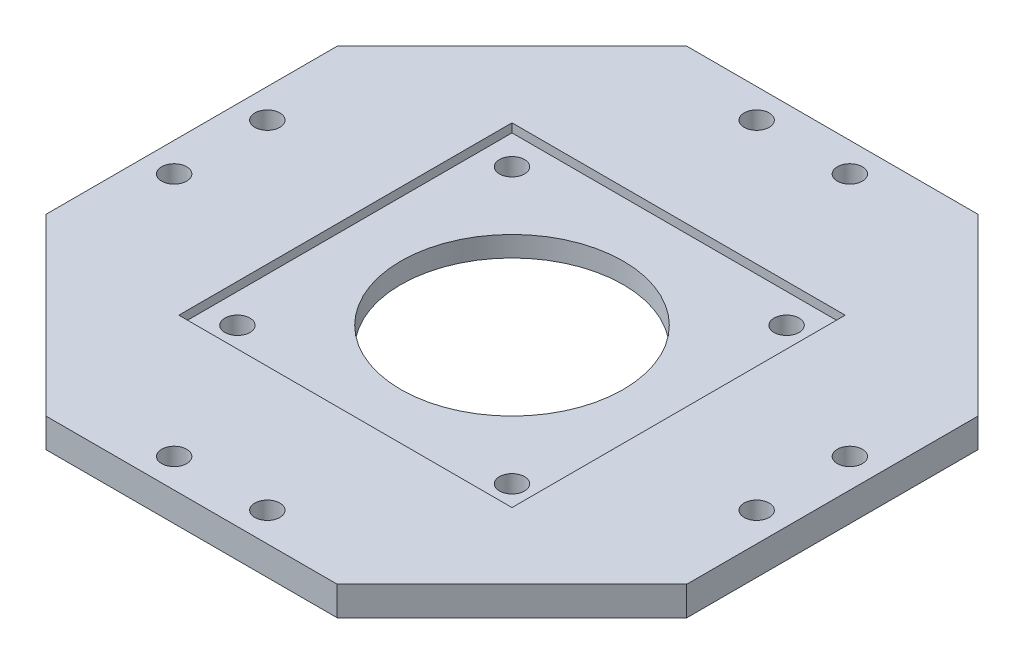
ISO-10303-21;
HEADER;
FILE_DESCRIPTION(('STEP AP214'),'2;1');
FILE_NAME('part.step','',(''),(''),'','','');
FILE_SCHEMA(('AUTOMOTIVE_DESIGN { 1 0 10303 214 1 1 1 1 }'));
ENDSEC;
DATA;
#1=APPLICATION_CONTEXT('core data for automotive mechanical design processes');
#2=APPLICATION_PROTOCOL_DEFINITION('international standard','automotive_design',2000,#1);
#3=PRODUCT_CONTEXT('',#1,'mechanical');
#4=PRODUCT('Part','Part','',(#3));
#5=PRODUCT_RELATED_PRODUCT_CATEGORY('part','',(#4));
#6=PRODUCT_DEFINITION_FORMATION('','',#4);
#7=PRODUCT_DEFINITION_CONTEXT('part definition',#1,'design');
#8=PRODUCT_DEFINITION('design','',#6,#7);
#9=PRODUCT_DEFINITION_SHAPE('','',#8);
#10=(LENGTH_UNIT() NAMED_UNIT(*) SI_UNIT(.MILLI.,.METRE.));
#11=(NAMED_UNIT(*) PLANE_ANGLE_UNIT() SI_UNIT($,.RADIAN.));
#12=(NAMED_UNIT(*) SI_UNIT($,.STERADIAN.) SOLID_ANGLE_UNIT());
#13=UNCERTAINTY_MEASURE_WITH_UNIT(LENGTH_MEASURE(1.E-05),#10,'distance_accuracy_value','');
#14=(GEOMETRIC_REPRESENTATION_CONTEXT(3) GLOBAL_UNCERTAINTY_ASSIGNED_CONTEXT((#13)) GLOBAL_UNIT_ASSIGNED_CONTEXT((#10,
#11,#12)) REPRESENTATION_CONTEXT('',''));
#15=CARTESIAN_POINT('',(0.,0.,0.));
#16=DIRECTION('',(0.,0.,1.));
#17=DIRECTION('',(1.,0.,0.));
#18=AXIS2_PLACEMENT_3D('',#15,#16,#17);
#19=CARTESIAN_POINT('',(0.,5.,0.));
#20=DIRECTION('',(0.,-1.,0.));
#21=DIRECTION('',(0.,0.,-1.));
#22=AXIS2_PLACEMENT_3D('',#19,#20,#21);
#23=PLANE('',#22);
#24=DIRECTION('',(-1.,0.,0.));
#25=VECTOR('',#24,1.);
#26=CARTESIAN_POINT('',(-28.6,5.,-28.6));
#27=LINE('',#26,#25);
#28=CARTESIAN_POINT('',(28.6,5.,-28.6));
#29=VERTEX_POINT('',#28);
#30=CARTESIAN_POINT('',(-28.6,5.,-28.6));
#31=VERTEX_POINT('',#30);
#32=EDGE_CURVE('E347',#29,#31,#27,.T.);
#33=ORIENTED_EDGE('',*,*,#32,.F.);
#34=DIRECTION('',(0.,0.,-1.));
#35=VECTOR('',#34,1.);
#36=CARTESIAN_POINT('',(28.6,5.,28.6));
#37=LINE('',#36,#35);
#38=CARTESIAN_POINT('',(28.6,5.,28.6));
#39=VERTEX_POINT('',#38);
#40=EDGE_CURVE('E56',#39,#29,#37,.T.);
#41=ORIENTED_EDGE('',*,*,#40,.F.);
#42=DIRECTION('',(1.,0.,0.));
#43=VECTOR('',#42,1.);
#44=CARTESIAN_POINT('',(-28.6,5.,28.6));
#45=LINE('',#44,#43);
#46=CARTESIAN_POINT('',(-28.6,5.,28.6));
#47=VERTEX_POINT('',#46);
#48=EDGE_CURVE('E338',#47,#39,#45,.T.);
#49=ORIENTED_EDGE('',*,*,#48,.F.);
#50=DIRECTION('',(0.,0.,1.));
#51=VECTOR('',#50,1.);
#52=CARTESIAN_POINT('',(-28.6,5.,28.6));
#53=LINE('',#52,#51);
#54=EDGE_CURVE('E343',#31,#47,#53,.T.);
#55=ORIENTED_EDGE('',*,*,#54,.F.);
#56=EDGE_LOOP('',(#33,#41,#49,#55));
#57=FACE_BOUND('',#56,.T.);
#58=DIRECTION('',(-0.707106781186547,0.,0.707106781186547));
#59=VECTOR('',#58,1.);
#60=CARTESIAN_POINT('',(-54.9999999999998,5.,-24.9999999999998));
#61=LINE('',#60,#59);
#62=CARTESIAN_POINT('',(-24.9999999999998,5.,-54.9999999999998));
#63=VERTEX_POINT('',#62);
#64=CARTESIAN_POINT('',(-54.9999999999998,5.,-24.9999999999998));
#65=VERTEX_POINT('',#64);
#66=EDGE_CURVE('E178',#63,#65,#61,.T.);
#67=ORIENTED_EDGE('',*,*,#66,.T.);
#68=DIRECTION('',(0.,0.,1.));
#69=VECTOR('',#68,1.);
#70=CARTESIAN_POINT('',(-54.9999999999998,5.,25.));
#71=LINE('',#70,#69);
#72=CARTESIAN_POINT('',(-54.9999999999998,5.,25.));
#73=VERTEX_POINT('',#72);
#74=EDGE_CURVE('E106',#65,#73,#71,.T.);
#75=ORIENTED_EDGE('',*,*,#74,.T.);
#76=DIRECTION('',(0.707106781186547,0.,0.707106781186548));
#77=VECTOR('',#76,1.);
#78=CARTESIAN_POINT('',(-24.9999999999998,5.,55.));
#79=LINE('',#78,#77);
#80=CARTESIAN_POINT('',(-24.9999999999998,5.,55.));
#81=VERTEX_POINT('',#80);
#82=EDGE_CURVE('E200',#73,#81,#79,.T.);
#83=ORIENTED_EDGE('',*,*,#82,.T.);
#84=DIRECTION('',(1.,0.,0.));
#85=VECTOR('',#84,1.);
#86=CARTESIAN_POINT('',(-24.9999999999998,5.,55.));
#87=LINE('',#86,#85);
#88=CARTESIAN_POINT('',(24.9999999999999,5.,55.));
#89=VERTEX_POINT('',#88);
#90=EDGE_CURVE('E214',#81,#89,#87,.T.);
#91=ORIENTED_EDGE('',*,*,#90,.T.);
#92=DIRECTION('',(0.707106781186547,0.,-0.707106781186547));
#93=VECTOR('',#92,1.);
#94=CARTESIAN_POINT('',(24.9999999999999,5.,55.));
#95=LINE('',#94,#93);
#96=CARTESIAN_POINT('',(54.9999999999999,5.,25.));
#97=VERTEX_POINT('',#96);
#98=EDGE_CURVE('E129',#89,#97,#95,.T.);
#99=ORIENTED_EDGE('',*,*,#98,.T.);
#100=DIRECTION('',(0.,0.,-1.));
#101=VECTOR('',#100,1.);
#102=CARTESIAN_POINT('',(54.9999999999999,5.,25.));
#103=LINE('',#102,#101);
#104=CARTESIAN_POINT('',(54.9999999999999,5.,-24.9999999999998));
#105=VERTEX_POINT('',#104);
#106=EDGE_CURVE('E122',#97,#105,#103,.T.);
#107=ORIENTED_EDGE('',*,*,#106,.T.);
#108=DIRECTION('',(-0.707106781186547,0.,-0.707106781186547));
#109=VECTOR('',#108,1.);
#110=CARTESIAN_POINT('',(24.9999999999999,5.,-54.9999999999998));
#111=LINE('',#110,#109);
#112=CARTESIAN_POINT('',(24.9999999999999,5.,-54.9999999999998));
#113=VERTEX_POINT('',#112);
#114=EDGE_CURVE('E126',#105,#113,#111,.T.);
#115=ORIENTED_EDGE('',*,*,#114,.T.);
#116=DIRECTION('',(-1.,0.,0.));
#117=VECTOR('',#116,1.);
#118=CARTESIAN_POINT('',(-24.9999999999998,5.,-54.9999999999998));
#119=LINE('',#118,#117);
#120=EDGE_CURVE('E65',#113,#63,#119,.T.);
#121=ORIENTED_EDGE('',*,*,#120,.T.);
#122=EDGE_LOOP('',(#67,#75,#83,#91,#99,#107,#115,#121));
#123=FACE_BOUND('',#122,.T.);
#124=CARTESIAN_POINT('',(-8.00000000000001,5.,-50.));
#125=DIRECTION('',(0.,1.,0.));
#126=DIRECTION('',(0.,0.,1.));
#127=AXIS2_PLACEMENT_3D('',#124,#125,#126);
#128=CIRCLE('',#127,2.15000000000002);
#129=CARTESIAN_POINT('',(-8.00000000000001,5.,-47.8499999999999));
#130=VERTEX_POINT('',#129);
#131=EDGE_CURVE('E243',#130,#130,#128,.T.);
#132=ORIENTED_EDGE('',*,*,#131,.F.);
#133=EDGE_LOOP('',(#132));
#134=FACE_BOUND('',#133,.T.);
#135=CARTESIAN_POINT('',(8.00000000000017,5.,-50.));
#136=DIRECTION('',(0.,1.,0.));
#137=DIRECTION('',(0.,0.,-1.));
#138=AXIS2_PLACEMENT_3D('',#135,#136,#137);
#139=CIRCLE('',#138,2.15000000000001);
#140=CARTESIAN_POINT('',(8.00000000000017,5.,-52.1500000000001));
#141=VERTEX_POINT('',#140);
#142=EDGE_CURVE('E248',#141,#141,#139,.T.);
#143=ORIENTED_EDGE('',*,*,#142,.F.);
#144=EDGE_LOOP('',(#143));
#145=FACE_BOUND('',#144,.T.);
#146=CARTESIAN_POINT('',(50.0000000000005,5.,-8.00000000000064));
#147=DIRECTION('',(0.,1.,0.));
#148=DIRECTION('',(0.,0.,1.));
#149=AXIS2_PLACEMENT_3D('',#146,#147,#148);
#150=CIRCLE('',#149,2.15000000000002);
#151=CARTESIAN_POINT('',(50.0000000000005,5.,-5.85000000000062));
#152=VERTEX_POINT('',#151);
#153=EDGE_CURVE('E256',#152,#152,#150,.T.);
#154=ORIENTED_EDGE('',*,*,#153,.F.);
#155=EDGE_LOOP('',(#154));
#156=FACE_BOUND('',#155,.T.);
#157=CARTESIAN_POINT('',(50.0000000000006,5.,7.99999999999954));
#158=DIRECTION('',(0.,1.,0.));
#159=DIRECTION('',(0.,0.,-1.));
#160=AXIS2_PLACEMENT_3D('',#157,#158,#159);
#161=CIRCLE('',#160,2.15000000000002);
#162=CARTESIAN_POINT('',(50.0000000000006,5.,5.84999999999952));
#163=VERTEX_POINT('',#162);
#164=EDGE_CURVE('E264',#163,#163,#161,.T.);
#165=ORIENTED_EDGE('',*,*,#164,.F.);
#166=EDGE_LOOP('',(#165));
#167=FACE_BOUND('',#166,.T.);
#168=CARTESIAN_POINT('',(8.00000000000106,5.,49.9999999999997));
#169=DIRECTION('',(0.,1.,0.));
#170=DIRECTION('',(0.,0.,1.));
#171=AXIS2_PLACEMENT_3D('',#168,#169,#170);
#172=CIRCLE('',#171,2.15000000000002);
#173=CARTESIAN_POINT('',(8.00000000000106,5.,52.1499999999998));
#174=VERTEX_POINT('',#173);
#175=EDGE_CURVE('E272',#174,#174,#172,.T.);
#176=ORIENTED_EDGE('',*,*,#175,.F.);
#177=EDGE_LOOP('',(#176));
#178=FACE_BOUND('',#177,.T.);
#179=CARTESIAN_POINT('',(-7.99999999999912,5.,49.9999999999997));
#180=DIRECTION('',(0.,1.,0.));
#181=DIRECTION('',(0.,0.,-1.));
#182=AXIS2_PLACEMENT_3D('',#179,#180,#181);
#183=CIRCLE('',#182,2.15000000000002);
#184=CARTESIAN_POINT('',(-7.99999999999912,5.,47.8499999999997));
#185=VERTEX_POINT('',#184);
#186=EDGE_CURVE('E280',#185,#185,#183,.T.);
#187=ORIENTED_EDGE('',*,*,#186,.F.);
#188=EDGE_LOOP('',(#187));
#189=FACE_BOUND('',#188,.T.);
#190=CARTESIAN_POINT('',(-49.9999999999992,5.,8.00000000000009));
#191=DIRECTION('',(0.,1.,0.));
#192=DIRECTION('',(0.,0.,1.));
#193=AXIS2_PLACEMENT_3D('',#190,#191,#192);
#194=CIRCLE('',#193,2.15000000000006);
#195=CARTESIAN_POINT('',(-49.9999999999992,5.,10.1500000000001));
#196=VERTEX_POINT('',#195);
#197=EDGE_CURVE('E288',#196,#196,#194,.T.);
#198=ORIENTED_EDGE('',*,*,#197,.F.);
#199=EDGE_LOOP('',(#198));
#200=FACE_BOUND('',#199,.T.);
#201=CARTESIAN_POINT('',(-49.9999999999992,5.,-8.00000000000009));
#202=DIRECTION('',(0.,1.,0.));
#203=DIRECTION('',(0.,0.,-1.));
#204=AXIS2_PLACEMENT_3D('',#201,#202,#203);
#205=CIRCLE('',#204,2.14999999999996);
#206=CARTESIAN_POINT('',(-49.9999999999992,5.,-10.15));
#207=VERTEX_POINT('',#206);
#208=EDGE_CURVE('E296',#207,#207,#205,.T.);
#209=ORIENTED_EDGE('',*,*,#208,.F.);
#210=EDGE_LOOP('',(#209));
#211=FACE_BOUND('',#210,.T.);
#212=ADVANCED_FACE('F39',(#57,#123,#134,#145,#156,#167,#178,#189,#200,#211),#23,.F.);
#213=CARTESIAN_POINT('',(0.,0.,0.));
#214=DIRECTION('',(0.,-1.,0.));
#215=DIRECTION('',(0.,0.,-1.));
#216=AXIS2_PLACEMENT_3D('',#213,#214,#215);
#217=PLANE('',#216);
#218=CARTESIAN_POINT('',(-49.9999999999992,0.,8.00000000000009));
#219=DIRECTION('',(0.,1.,0.));
#220=DIRECTION('',(0.,0.,1.));
#221=AXIS2_PLACEMENT_3D('',#218,#219,#220);
#222=CIRCLE('',#221,2.15000000000006);
#223=CARTESIAN_POINT('',(-49.9999999999992,0.,10.1500000000001));
#224=VERTEX_POINT('',#223);
#225=EDGE_CURVE('E292',#224,#224,#222,.T.);
#226=ORIENTED_EDGE('',*,*,#225,.T.);
#227=EDGE_LOOP('',(#226));
#228=FACE_BOUND('',#227,.T.);
#229=CARTESIAN_POINT('',(8.00000000000106,0.,49.9999999999997));
#230=DIRECTION('',(0.,1.,0.));
#231=DIRECTION('',(0.,0.,1.));
#232=AXIS2_PLACEMENT_3D('',#229,#230,#231);
#233=CIRCLE('',#232,2.15000000000002);
#234=CARTESIAN_POINT('',(8.00000000000106,0.,52.1499999999998));
#235=VERTEX_POINT('',#234);
#236=EDGE_CURVE('E276',#235,#235,#233,.T.);
#237=ORIENTED_EDGE('',*,*,#236,.T.);
#238=EDGE_LOOP('',(#237));
#239=FACE_BOUND('',#238,.T.);
#240=CARTESIAN_POINT('',(50.0000000000005,0.,-8.00000000000064));
#241=DIRECTION('',(0.,1.,0.));
#242=DIRECTION('',(0.,0.,1.));
#243=AXIS2_PLACEMENT_3D('',#240,#241,#242);
#244=CIRCLE('',#243,2.15000000000002);
#245=CARTESIAN_POINT('',(50.0000000000005,0.,-5.85000000000062));
#246=VERTEX_POINT('',#245);
#247=EDGE_CURVE('E260',#246,#246,#244,.T.);
#248=ORIENTED_EDGE('',*,*,#247,.T.);
#249=EDGE_LOOP('',(#248));
#250=FACE_BOUND('',#249,.T.);
#251=CARTESIAN_POINT('',(-8.00000000000001,0.,-50.));
#252=DIRECTION('',(0.,1.,0.));
#253=DIRECTION('',(0.,0.,1.));
#254=AXIS2_PLACEMENT_3D('',#251,#252,#253);
#255=CIRCLE('',#254,2.15000000000002);
#256=CARTESIAN_POINT('',(-8.00000000000001,0.,-47.8499999999999));
#257=VERTEX_POINT('',#256);
#258=EDGE_CURVE('E244',#257,#257,#255,.T.);
#259=ORIENTED_EDGE('',*,*,#258,.T.);
#260=EDGE_LOOP('',(#259));
#261=FACE_BOUND('',#260,.T.);
#262=CARTESIAN_POINT('',(-23.5699999999995,0.,23.5700000000003));
#263=DIRECTION('',(0.,1.,0.));
#264=DIRECTION('',(0.,0.,1.));
#265=AXIS2_PLACEMENT_3D('',#262,#263,#264);
#266=CIRCLE('',#265,2.15000000000002);
#267=CARTESIAN_POINT('',(-23.5699999999995,0.,25.7200000000003));
#268=VERTEX_POINT('',#267);
#269=EDGE_CURVE('E235',#268,#268,#266,.T.);
#270=ORIENTED_EDGE('',*,*,#269,.T.);
#271=EDGE_LOOP('',(#270));
#272=FACE_BOUND('',#271,.T.);
#273=CARTESIAN_POINT('',(0.,0.,0.));
#274=DIRECTION('',(0.,1.,0.));
#275=DIRECTION('',(0.,0.,1.));
#276=AXIS2_PLACEMENT_3D('',#273,#274,#275);
#277=CIRCLE('',#276,19.1);
#278=CARTESIAN_POINT('',(0.,0.,19.1));
#279=VERTEX_POINT('',#278);
#280=EDGE_CURVE('E227',#279,#279,#277,.T.);
#281=ORIENTED_EDGE('',*,*,#280,.T.);
#282=EDGE_LOOP('',(#281));
#283=FACE_BOUND('',#282,.T.);
#284=DIRECTION('',(-0.707106781186547,0.,0.707106781186547));
#285=VECTOR('',#284,1.);
#286=CARTESIAN_POINT('',(-54.9999999999998,0.,-24.9999999999998));
#287=LINE('',#286,#285);
#288=CARTESIAN_POINT('',(-24.9999999999998,0.,-54.9999999999998));
#289=VERTEX_POINT('',#288);
#290=CARTESIAN_POINT('',(-54.9999999999998,0.,-24.9999999999998));
#291=VERTEX_POINT('',#290);
#292=EDGE_CURVE('E154',#289,#291,#287,.T.);
#293=ORIENTED_EDGE('',*,*,#292,.F.);
#294=DIRECTION('',(-1.,0.,0.));
#295=VECTOR('',#294,1.);
#296=CARTESIAN_POINT('',(-24.9999999999998,0.,-54.9999999999998));
#297=LINE('',#296,#295);
#298=CARTESIAN_POINT('',(24.9999999999999,0.,-54.9999999999998));
#299=VERTEX_POINT('',#298);
#300=EDGE_CURVE('E98',#299,#289,#297,.T.);
#301=ORIENTED_EDGE('',*,*,#300,.F.);
#302=DIRECTION('',(-0.707106781186547,0.,-0.707106781186547));
#303=VECTOR('',#302,1.);
#304=CARTESIAN_POINT('',(24.9999999999999,0.,-54.9999999999998));
#305=LINE('',#304,#303);
#306=CARTESIAN_POINT('',(54.9999999999999,0.,-24.9999999999998));
#307=VERTEX_POINT('',#306);
#308=EDGE_CURVE('E173',#307,#299,#305,.T.);
#309=ORIENTED_EDGE('',*,*,#308,.F.);
#310=DIRECTION('',(0.,0.,-1.));
#311=VECTOR('',#310,1.);
#312=CARTESIAN_POINT('',(54.9999999999999,0.,25.));
#313=LINE('',#312,#311);
#314=CARTESIAN_POINT('',(54.9999999999999,0.,25.));
#315=VERTEX_POINT('',#314);
#316=EDGE_CURVE('E139',#315,#307,#313,.T.);
#317=ORIENTED_EDGE('',*,*,#316,.F.);
#318=DIRECTION('',(0.707106781186547,0.,-0.707106781186547));
#319=VECTOR('',#318,1.);
#320=CARTESIAN_POINT('',(24.9999999999999,0.,55.));
#321=LINE('',#320,#319);
#322=CARTESIAN_POINT('',(24.9999999999999,0.,55.));
#323=VERTEX_POINT('',#322);
#324=EDGE_CURVE('E168',#323,#315,#321,.T.);
#325=ORIENTED_EDGE('',*,*,#324,.F.);
#326=DIRECTION('',(1.,0.,0.));
#327=VECTOR('',#326,1.);
#328=CARTESIAN_POINT('',(-24.9999999999998,0.,55.));
#329=LINE('',#328,#327);
#330=CARTESIAN_POINT('',(-24.9999999999998,0.,55.));
#331=VERTEX_POINT('',#330);
#332=EDGE_CURVE('E165',#331,#323,#329,.T.);
#333=ORIENTED_EDGE('',*,*,#332,.F.);
#334=DIRECTION('',(0.707106781186547,0.,0.707106781186548));
#335=VECTOR('',#334,1.);
#336=CARTESIAN_POINT('',(-24.9999999999998,0.,55.));
#337=LINE('',#336,#335);
#338=CARTESIAN_POINT('',(-54.9999999999998,0.,25.));
#339=VERTEX_POINT('',#338);
#340=EDGE_CURVE('E162',#339,#331,#337,.T.);
#341=ORIENTED_EDGE('',*,*,#340,.F.);
#342=DIRECTION('',(0.,0.,1.));
#343=VECTOR('',#342,1.);
#344=CARTESIAN_POINT('',(-54.9999999999998,0.,25.));
#345=LINE('',#344,#343);
#346=EDGE_CURVE('E158',#291,#339,#345,.T.);
#347=ORIENTED_EDGE('',*,*,#346,.F.);
#348=EDGE_LOOP('',(#293,#301,#309,#317,#325,#333,#341,#347));
#349=FACE_BOUND('',#348,.T.);
#350=CARTESIAN_POINT('',(23.57,0.,-23.57));
#351=DIRECTION('',(0.,1.,0.));
#352=DIRECTION('',(0.,0.,1.));
#353=AXIS2_PLACEMENT_3D('',#350,#351,#352);
#354=CIRCLE('',#353,2.15000000000002);
#355=CARTESIAN_POINT('',(23.57,0.,-21.42));
#356=VERTEX_POINT('',#355);
#357=EDGE_CURVE('E159',#356,#356,#354,.T.);
#358=ORIENTED_EDGE('',*,*,#357,.T.);
#359=EDGE_LOOP('',(#358));
#360=FACE_BOUND('',#359,.T.);
#361=CARTESIAN_POINT('',(-23.57,0.,-23.5699999999997));
#362=DIRECTION('',(0.,1.,0.));
#363=DIRECTION('',(0.,0.,1.));
#364=AXIS2_PLACEMENT_3D('',#361,#362,#363);
#365=CIRCLE('',#364,2.15000000000002);
#366=CARTESIAN_POINT('',(-23.57,0.,-21.4199999999997));
#367=VERTEX_POINT('',#366);
#368=EDGE_CURVE('E231',#367,#367,#365,.T.);
#369=ORIENTED_EDGE('',*,*,#368,.T.);
#370=EDGE_LOOP('',(#369));
#371=FACE_BOUND('',#370,.T.);
#372=CARTESIAN_POINT('',(23.5700000000005,0.,23.57));
#373=DIRECTION('',(0.,1.,0.));
#374=DIRECTION('',(0.,0.,1.));
#375=AXIS2_PLACEMENT_3D('',#372,#373,#374);
#376=CIRCLE('',#375,2.14999999999996);
#377=CARTESIAN_POINT('',(23.5700000000005,0.,25.7199999999999));
#378=VERTEX_POINT('',#377);
#379=EDGE_CURVE('E239',#378,#378,#376,.T.);
#380=ORIENTED_EDGE('',*,*,#379,.T.);
#381=EDGE_LOOP('',(#380));
#382=FACE_BOUND('',#381,.T.);
#383=CARTESIAN_POINT('',(8.00000000000017,0.,-50.));
#384=DIRECTION('',(0.,1.,0.));
#385=DIRECTION('',(0.,0.,-1.));
#386=AXIS2_PLACEMENT_3D('',#383,#384,#385);
#387=CIRCLE('',#386,2.15000000000001);
#388=CARTESIAN_POINT('',(8.00000000000017,0.,-52.1500000000001));
#389=VERTEX_POINT('',#388);
#390=EDGE_CURVE('E252',#389,#389,#387,.T.);
#391=ORIENTED_EDGE('',*,*,#390,.T.);
#392=EDGE_LOOP('',(#391));
#393=FACE_BOUND('',#392,.T.);
#394=CARTESIAN_POINT('',(50.0000000000006,0.,7.99999999999954));
#395=DIRECTION('',(0.,1.,0.));
#396=DIRECTION('',(0.,0.,-1.));
#397=AXIS2_PLACEMENT_3D('',#394,#395,#396);
#398=CIRCLE('',#397,2.15000000000002);
#399=CARTESIAN_POINT('',(50.0000000000006,0.,5.84999999999952));
#400=VERTEX_POINT('',#399);
#401=EDGE_CURVE('E268',#400,#400,#398,.T.);
#402=ORIENTED_EDGE('',*,*,#401,.T.);
#403=EDGE_LOOP('',(#402));
#404=FACE_BOUND('',#403,.T.);
#405=CARTESIAN_POINT('',(-7.99999999999912,0.,49.9999999999997));
#406=DIRECTION('',(0.,1.,0.));
#407=DIRECTION('',(0.,0.,-1.));
#408=AXIS2_PLACEMENT_3D('',#405,#406,#407);
#409=CIRCLE('',#408,2.15000000000002);
#410=CARTESIAN_POINT('',(-7.99999999999912,0.,47.8499999999997));
#411=VERTEX_POINT('',#410);
#412=EDGE_CURVE('E284',#411,#411,#409,.T.);
#413=ORIENTED_EDGE('',*,*,#412,.T.);
#414=EDGE_LOOP('',(#413));
#415=FACE_BOUND('',#414,.T.);
#416=CARTESIAN_POINT('',(-49.9999999999992,0.,-8.00000000000009));
#417=DIRECTION('',(0.,1.,0.));
#418=DIRECTION('',(0.,0.,-1.));
#419=AXIS2_PLACEMENT_3D('',#416,#417,#418);
#420=CIRCLE('',#419,2.14999999999996);
#421=CARTESIAN_POINT('',(-49.9999999999992,0.,-10.15));
#422=VERTEX_POINT('',#421);
#423=EDGE_CURVE('E300',#422,#422,#420,.T.);
#424=ORIENTED_EDGE('',*,*,#423,.T.);
#425=EDGE_LOOP('',(#424));
#426=FACE_BOUND('',#425,.T.);
#427=ADVANCED_FACE('F204',(#228,#239,#250,#261,#272,#283,#349,#360,#371,#382,#393,#404,#415,
#426),#217,.T.);
#428=CARTESIAN_POINT('',(-54.9999999999998,5.,-24.9999999999998));
#429=DIRECTION('',(0.707106781186548,0.,0.707106781186548));
#430=DIRECTION('',(0.707106781186548,0.,-0.707106781186548));
#431=AXIS2_PLACEMENT_3D('',#428,#429,#430);
#432=PLANE('',#431);
#433=ORIENTED_EDGE('',*,*,#292,.T.);
#434=DIRECTION('',(0.,-1.,0.));
#435=VECTOR('',#434,1.);
#436=CARTESIAN_POINT('',(-54.9999999999998,5.,-24.9999999999998));
#437=LINE('',#436,#435);
#438=EDGE_CURVE('E11',#65,#291,#437,.T.);
#439=ORIENTED_EDGE('',*,*,#438,.F.);
#440=ORIENTED_EDGE('',*,*,#66,.F.);
#441=DIRECTION('',(0.,-1.,0.));
#442=VECTOR('',#441,1.);
#443=CARTESIAN_POINT('',(-24.9999999999998,5.,-54.9999999999998));
#444=LINE('',#443,#442);
#445=EDGE_CURVE('E150',#63,#289,#444,.T.);
#446=ORIENTED_EDGE('',*,*,#445,.T.);
#447=EDGE_LOOP('',(#433,#439,#440,#446));
#448=FACE_BOUND('',#447,.T.);
#449=ADVANCED_FACE('F41',(#448),#432,.F.);
#450=CARTESIAN_POINT('',(-54.9999999999998,5.,25.));
#451=DIRECTION('',(1.,0.,0.));
#452=DIRECTION('',(0.,0.,-1.));
#453=AXIS2_PLACEMENT_3D('',#450,#451,#452);
#454=PLANE('',#453);
#455=ORIENTED_EDGE('',*,*,#346,.T.);
#456=DIRECTION('',(0.,-1.,0.));
#457=VECTOR('',#456,1.);
#458=CARTESIAN_POINT('',(-54.9999999999998,5.,25.));
#459=LINE('',#458,#457);
#460=EDGE_CURVE('E49',#73,#339,#459,.T.);
#461=ORIENTED_EDGE('',*,*,#460,.F.);
#462=ORIENTED_EDGE('',*,*,#74,.F.);
#463=ORIENTED_EDGE('',*,*,#438,.T.);
#464=EDGE_LOOP('',(#455,#461,#462,#463));
#465=FACE_BOUND('',#464,.T.);
#466=ADVANCED_FACE('F429',(#465),#454,.F.);
#467=CARTESIAN_POINT('',(-24.9999999999998,5.,55.));
#468=DIRECTION('',(0.707106781186548,0.,-0.707106781186547));
#469=DIRECTION('',(-0.707106781186547,0.,-0.707106781186548));
#470=AXIS2_PLACEMENT_3D('',#467,#468,#469);
#471=PLANE('',#470);
#472=ORIENTED_EDGE('',*,*,#340,.T.);
#473=DIRECTION('',(0.,-1.,0.));
#474=VECTOR('',#473,1.);
#475=CARTESIAN_POINT('',(-24.9999999999998,5.,55.));
#476=LINE('',#475,#474);
#477=EDGE_CURVE('E189',#81,#331,#476,.T.);
#478=ORIENTED_EDGE('',*,*,#477,.F.);
#479=ORIENTED_EDGE('',*,*,#82,.F.);
#480=ORIENTED_EDGE('',*,*,#460,.T.);
#481=EDGE_LOOP('',(#472,#478,#479,#480));
#482=FACE_BOUND('',#481,.T.);
#483=ADVANCED_FACE('F198',(#482),#471,.F.);
#484=CARTESIAN_POINT('',(-24.9999999999998,5.,55.));
#485=DIRECTION('',(0.,0.,-1.));
#486=DIRECTION('',(-1.,0.,0.));
#487=AXIS2_PLACEMENT_3D('',#484,#485,#486);
#488=PLANE('',#487);
#489=ORIENTED_EDGE('',*,*,#332,.T.);
#490=DIRECTION('',(0.,-1.,0.));
#491=VECTOR('',#490,1.);
#492=CARTESIAN_POINT('',(24.9999999999999,5.,55.));
#493=LINE('',#492,#491);
#494=EDGE_CURVE('E185',#89,#323,#493,.T.);
#495=ORIENTED_EDGE('',*,*,#494,.F.);
#496=ORIENTED_EDGE('',*,*,#90,.F.);
#497=ORIENTED_EDGE('',*,*,#477,.T.);
#498=EDGE_LOOP('',(#489,#495,#496,#497));
#499=FACE_BOUND('',#498,.T.);
#500=ADVANCED_FACE('F209',(#499),#488,.F.);
#501=CARTESIAN_POINT('',(24.9999999999999,5.,55.));
#502=DIRECTION('',(-0.707106781186548,0.,-0.707106781186548));
#503=DIRECTION('',(-0.707106781186548,0.,0.707106781186548));
#504=AXIS2_PLACEMENT_3D('',#501,#502,#503);
#505=PLANE('',#504);
#506=ORIENTED_EDGE('',*,*,#324,.T.);
#507=DIRECTION('',(0.,-1.,0.));
#508=VECTOR('',#507,1.);
#509=CARTESIAN_POINT('',(54.9999999999999,5.,25.));
#510=LINE('',#509,#508);
#511=EDGE_CURVE('E143',#97,#315,#510,.T.);
#512=ORIENTED_EDGE('',*,*,#511,.F.);
#513=ORIENTED_EDGE('',*,*,#98,.F.);
#514=ORIENTED_EDGE('',*,*,#494,.T.);
#515=EDGE_LOOP('',(#506,#512,#513,#514));
#516=FACE_BOUND('',#515,.T.);
#517=ADVANCED_FACE('F212',(#516),#505,.F.);
#518=CARTESIAN_POINT('',(54.9999999999999,5.,25.));
#519=DIRECTION('',(-1.,0.,0.));
#520=DIRECTION('',(0.,0.,1.));
#521=AXIS2_PLACEMENT_3D('',#518,#519,#520);
#522=PLANE('',#521);
#523=ORIENTED_EDGE('',*,*,#316,.T.);
#524=DIRECTION('',(0.,-1.,0.));
#525=VECTOR('',#524,1.);
#526=CARTESIAN_POINT('',(54.9999999999999,5.,-24.9999999999998));
#527=LINE('',#526,#525);
#528=EDGE_CURVE('E136',#105,#307,#527,.T.);
#529=ORIENTED_EDGE('',*,*,#528,.F.);
#530=ORIENTED_EDGE('',*,*,#106,.F.);
#531=ORIENTED_EDGE('',*,*,#511,.T.);
#532=EDGE_LOOP('',(#523,#529,#530,#531));
#533=FACE_BOUND('',#532,.T.);
#534=ADVANCED_FACE('F137',(#533),#522,.F.);
#535=CARTESIAN_POINT('',(24.9999999999999,5.,-54.9999999999998));
#536=DIRECTION('',(-0.707106781186548,0.,0.707106781186548));
#537=DIRECTION('',(0.707106781186548,0.,0.707106781186548));
#538=AXIS2_PLACEMENT_3D('',#535,#536,#537);
#539=PLANE('',#538);
#540=ORIENTED_EDGE('',*,*,#308,.T.);
#541=DIRECTION('',(0.,-1.,0.));
#542=VECTOR('',#541,1.);
#543=CARTESIAN_POINT('',(24.9999999999999,5.,-54.9999999999998));
#544=LINE('',#543,#542);
#545=EDGE_CURVE('E144',#113,#299,#544,.T.);
#546=ORIENTED_EDGE('',*,*,#545,.F.);
#547=ORIENTED_EDGE('',*,*,#114,.F.);
#548=ORIENTED_EDGE('',*,*,#528,.T.);
#549=EDGE_LOOP('',(#540,#546,#547,#548));
#550=FACE_BOUND('',#549,.T.);
#551=ADVANCED_FACE('F146',(#550),#539,.F.);
#552=CARTESIAN_POINT('',(-24.9999999999998,5.,-54.9999999999998));
#553=DIRECTION('',(0.,0.,1.));
#554=DIRECTION('',(1.,0.,0.));
#555=AXIS2_PLACEMENT_3D('',#552,#553,#554);
#556=PLANE('',#555);
#557=ORIENTED_EDGE('',*,*,#300,.T.);
#558=ORIENTED_EDGE('',*,*,#445,.F.);
#559=ORIENTED_EDGE('',*,*,#120,.F.);
#560=ORIENTED_EDGE('',*,*,#545,.T.);
#561=EDGE_LOOP('',(#557,#558,#559,#560));
#562=FACE_BOUND('',#561,.T.);
#563=ADVANCED_FACE('F417',(#562),#556,.F.);
#564=CARTESIAN_POINT('',(23.57,5.,-23.57));
#565=DIRECTION('',(0.,-1.,0.));
#566=DIRECTION('',(0.,0.,-1.));
#567=AXIS2_PLACEMENT_3D('',#564,#565,#566);
#568=CYLINDRICAL_SURFACE('',#567,2.15000000000002);
#569=CARTESIAN_POINT('',(23.57,3.5,-23.57));
#570=DIRECTION('',(0.,-1.,0.));
#571=DIRECTION('',(0.,0.,-1.));
#572=AXIS2_PLACEMENT_3D('',#569,#570,#571);
#573=CIRCLE('',#572,2.15000000000002);
#574=CARTESIAN_POINT('',(23.57,3.5,-25.7200000000001));
#575=VERTEX_POINT('',#574);
#576=EDGE_CURVE('E304',#575,#575,#573,.T.);
#577=ORIENTED_EDGE('',*,*,#576,.F.);
#578=EDGE_LOOP('',(#577));
#579=FACE_BOUND('',#578,.T.);
#580=ORIENTED_EDGE('',*,*,#357,.F.);
#581=EDGE_LOOP('',(#580));
#582=FACE_BOUND('',#581,.T.);
#583=ADVANCED_FACE('F414',(#579,#582),#568,.F.);
#584=CARTESIAN_POINT('',(0.,5.,0.));
#585=DIRECTION('',(0.,-1.,0.));
#586=DIRECTION('',(0.,0.,-1.));
#587=AXIS2_PLACEMENT_3D('',#584,#585,#586);
#588=CYLINDRICAL_SURFACE('',#587,19.1);
#589=CARTESIAN_POINT('',(0.,3.5,0.));
#590=DIRECTION('',(0.,-1.,0.));
#591=DIRECTION('',(0.,0.,-1.));
#592=AXIS2_PLACEMENT_3D('',#589,#590,#591);
#593=CIRCLE('',#592,19.1);
#594=CARTESIAN_POINT('',(0.,3.5,-19.1));
#595=VERTEX_POINT('',#594);
#596=EDGE_CURVE('E311',#595,#595,#593,.T.);
#597=ORIENTED_EDGE('',*,*,#596,.F.);
#598=EDGE_LOOP('',(#597));
#599=FACE_BOUND('',#598,.T.);
#600=ORIENTED_EDGE('',*,*,#280,.F.);
#601=EDGE_LOOP('',(#600));
#602=FACE_BOUND('',#601,.T.);
#603=ADVANCED_FACE('F493',(#599,#602),#588,.F.);
#604=CARTESIAN_POINT('',(-23.57,5.,-23.5699999999997));
#605=DIRECTION('',(0.,-1.,0.));
#606=DIRECTION('',(0.,0.,-1.));
#607=AXIS2_PLACEMENT_3D('',#604,#605,#606);
#608=CYLINDRICAL_SURFACE('',#607,2.15000000000002);
#609=CARTESIAN_POINT('',(-23.57,3.5,-23.5699999999997));
#610=DIRECTION('',(0.,-1.,0.));
#611=DIRECTION('',(0.,0.,-1.));
#612=AXIS2_PLACEMENT_3D('',#609,#610,#611);
#613=CIRCLE('',#612,2.15000000000002);
#614=CARTESIAN_POINT('',(-23.57,3.5,-25.7199999999997));
#615=VERTEX_POINT('',#614);
#616=EDGE_CURVE('E315',#615,#615,#613,.T.);
#617=ORIENTED_EDGE('',*,*,#616,.F.);
#618=EDGE_LOOP('',(#617));
#619=FACE_BOUND('',#618,.T.);
#620=ORIENTED_EDGE('',*,*,#368,.F.);
#621=EDGE_LOOP('',(#620));
#622=FACE_BOUND('',#621,.T.);
#623=ADVANCED_FACE('F501',(#619,#622),#608,.F.);
#624=CARTESIAN_POINT('',(-23.5699999999995,5.,23.5700000000003));
#625=DIRECTION('',(0.,-1.,0.));
#626=DIRECTION('',(0.,0.,-1.));
#627=AXIS2_PLACEMENT_3D('',#624,#625,#626);
#628=CYLINDRICAL_SURFACE('',#627,2.15000000000002);
#629=CARTESIAN_POINT('',(-23.5699999999995,3.5,23.5700000000003));
#630=DIRECTION('',(0.,-1.,0.));
#631=DIRECTION('',(0.,0.,-1.));
#632=AXIS2_PLACEMENT_3D('',#629,#630,#631);
#633=CIRCLE('',#632,2.15000000000002);
#634=CARTESIAN_POINT('',(-23.5699999999995,3.5,21.4200000000003));
#635=VERTEX_POINT('',#634);
#636=EDGE_CURVE('E319',#635,#635,#633,.T.);
#637=ORIENTED_EDGE('',*,*,#636,.F.);
#638=EDGE_LOOP('',(#637));
#639=FACE_BOUND('',#638,.T.);
#640=ORIENTED_EDGE('',*,*,#269,.F.);
#641=EDGE_LOOP('',(#640));
#642=FACE_BOUND('',#641,.T.);
#643=ADVANCED_FACE('F509',(#639,#642),#628,.F.);
#644=CARTESIAN_POINT('',(23.5700000000005,5.,23.57));
#645=DIRECTION('',(0.,-1.,0.));
#646=DIRECTION('',(0.,0.,-1.));
#647=AXIS2_PLACEMENT_3D('',#644,#645,#646);
#648=CYLINDRICAL_SURFACE('',#647,2.14999999999996);
#649=CARTESIAN_POINT('',(23.5700000000005,3.5,23.57));
#650=DIRECTION('',(0.,-1.,0.));
#651=DIRECTION('',(0.,0.,-1.));
#652=AXIS2_PLACEMENT_3D('',#649,#650,#651);
#653=CIRCLE('',#652,2.14999999999996);
#654=CARTESIAN_POINT('',(23.5700000000005,3.5,21.42));
#655=VERTEX_POINT('',#654);
#656=EDGE_CURVE('E43',#655,#655,#653,.T.);
#657=ORIENTED_EDGE('',*,*,#656,.F.);
#658=EDGE_LOOP('',(#657));
#659=FACE_BOUND('',#658,.T.);
#660=ORIENTED_EDGE('',*,*,#379,.F.);
#661=EDGE_LOOP('',(#660));
#662=FACE_BOUND('',#661,.T.);
#663=ADVANCED_FACE('F518',(#659,#662),#648,.F.);
#664=CARTESIAN_POINT('',(-8.00000000000001,5.,-50.));
#665=DIRECTION('',(0.,-1.,0.));
#666=DIRECTION('',(0.,0.,-1.));
#667=AXIS2_PLACEMENT_3D('',#664,#665,#666);
#668=CYLINDRICAL_SURFACE('',#667,2.15000000000002);
#669=ORIENTED_EDGE('',*,*,#131,.T.);
#670=EDGE_LOOP('',(#669));
#671=FACE_BOUND('',#670,.T.);
#672=ORIENTED_EDGE('',*,*,#258,.F.);
#673=EDGE_LOOP('',(#672));
#674=FACE_BOUND('',#673,.T.);
#675=ADVANCED_FACE('F527',(#671,#674),#668,.F.);
#676=CARTESIAN_POINT('',(8.00000000000017,5.,-50.));
#677=DIRECTION('',(0.,-1.,0.));
#678=DIRECTION('',(0.,0.,-1.));
#679=AXIS2_PLACEMENT_3D('',#676,#677,#678);
#680=CYLINDRICAL_SURFACE('',#679,2.15000000000001);
#681=ORIENTED_EDGE('',*,*,#142,.T.);
#682=EDGE_LOOP('',(#681));
#683=FACE_BOUND('',#682,.T.);
#684=ORIENTED_EDGE('',*,*,#390,.F.);
#685=EDGE_LOOP('',(#684));
#686=FACE_BOUND('',#685,.T.);
#687=ADVANCED_FACE('F536',(#683,#686),#680,.F.);
#688=CARTESIAN_POINT('',(50.0000000000005,5.,-8.00000000000064));
#689=DIRECTION('',(0.,-1.,0.));
#690=DIRECTION('',(0.,0.,-1.));
#691=AXIS2_PLACEMENT_3D('',#688,#689,#690);
#692=CYLINDRICAL_SURFACE('',#691,2.15000000000002);
#693=ORIENTED_EDGE('',*,*,#153,.T.);
#694=EDGE_LOOP('',(#693));
#695=FACE_BOUND('',#694,.T.);
#696=ORIENTED_EDGE('',*,*,#247,.F.);
#697=EDGE_LOOP('',(#696));
#698=FACE_BOUND('',#697,.T.);
#699=ADVANCED_FACE('F545',(#695,#698),#692,.F.);
#700=CARTESIAN_POINT('',(50.0000000000006,5.,7.99999999999954));
#701=DIRECTION('',(0.,-1.,0.));
#702=DIRECTION('',(0.,0.,-1.));
#703=AXIS2_PLACEMENT_3D('',#700,#701,#702);
#704=CYLINDRICAL_SURFACE('',#703,2.15000000000002);
#705=ORIENTED_EDGE('',*,*,#164,.T.);
#706=EDGE_LOOP('',(#705));
#707=FACE_BOUND('',#706,.T.);
#708=ORIENTED_EDGE('',*,*,#401,.F.);
#709=EDGE_LOOP('',(#708));
#710=FACE_BOUND('',#709,.T.);
#711=ADVANCED_FACE('F554',(#707,#710),#704,.F.);
#712=CARTESIAN_POINT('',(8.00000000000106,5.,49.9999999999997));
#713=DIRECTION('',(0.,-1.,0.));
#714=DIRECTION('',(0.,0.,-1.));
#715=AXIS2_PLACEMENT_3D('',#712,#713,#714);
#716=CYLINDRICAL_SURFACE('',#715,2.15000000000002);
#717=ORIENTED_EDGE('',*,*,#175,.T.);
#718=EDGE_LOOP('',(#717));
#719=FACE_BOUND('',#718,.T.);
#720=ORIENTED_EDGE('',*,*,#236,.F.);
#721=EDGE_LOOP('',(#720));
#722=FACE_BOUND('',#721,.T.);
#723=ADVANCED_FACE('F563',(#719,#722),#716,.F.);
#724=CARTESIAN_POINT('',(-7.99999999999912,5.,49.9999999999997));
#725=DIRECTION('',(0.,-1.,0.));
#726=DIRECTION('',(0.,0.,-1.));
#727=AXIS2_PLACEMENT_3D('',#724,#725,#726);
#728=CYLINDRICAL_SURFACE('',#727,2.15000000000002);
#729=ORIENTED_EDGE('',*,*,#186,.T.);
#730=EDGE_LOOP('',(#729));
#731=FACE_BOUND('',#730,.T.);
#732=ORIENTED_EDGE('',*,*,#412,.F.);
#733=EDGE_LOOP('',(#732));
#734=FACE_BOUND('',#733,.T.);
#735=ADVANCED_FACE('F572',(#731,#734),#728,.F.);
#736=CARTESIAN_POINT('',(-49.9999999999992,5.,8.00000000000009));
#737=DIRECTION('',(0.,-1.,0.));
#738=DIRECTION('',(0.,0.,-1.));
#739=AXIS2_PLACEMENT_3D('',#736,#737,#738);
#740=CYLINDRICAL_SURFACE('',#739,2.15000000000006);
#741=ORIENTED_EDGE('',*,*,#197,.T.);
#742=EDGE_LOOP('',(#741));
#743=FACE_BOUND('',#742,.T.);
#744=ORIENTED_EDGE('',*,*,#225,.F.);
#745=EDGE_LOOP('',(#744));
#746=FACE_BOUND('',#745,.T.);
#747=ADVANCED_FACE('F581',(#743,#746),#740,.F.);
#748=CARTESIAN_POINT('',(-49.9999999999992,5.,-8.00000000000009));
#749=DIRECTION('',(0.,-1.,0.));
#750=DIRECTION('',(0.,0.,-1.));
#751=AXIS2_PLACEMENT_3D('',#748,#749,#750);
#752=CYLINDRICAL_SURFACE('',#751,2.14999999999996);
#753=ORIENTED_EDGE('',*,*,#208,.T.);
#754=EDGE_LOOP('',(#753));
#755=FACE_BOUND('',#754,.T.);
#756=ORIENTED_EDGE('',*,*,#423,.F.);
#757=EDGE_LOOP('',(#756));
#758=FACE_BOUND('',#757,.T.);
#759=ADVANCED_FACE('F590',(#755,#758),#752,.F.);
#760=CARTESIAN_POINT('',(28.6,3.5,28.6));
#761=DIRECTION('',(1.,0.,0.));
#762=DIRECTION('',(0.,0.,-1.));
#763=AXIS2_PLACEMENT_3D('',#760,#761,#762);
#764=PLANE('',#763);
#765=ORIENTED_EDGE('',*,*,#40,.T.);
#766=DIRECTION('',(0.,1.,0.));
#767=VECTOR('',#766,1.);
#768=CARTESIAN_POINT('',(28.6,3.5,-28.6));
#769=LINE('',#768,#767);
#770=CARTESIAN_POINT('',(28.6,3.5,-28.6));
#771=VERTEX_POINT('',#770);
#772=EDGE_CURVE('E323',#771,#29,#769,.T.);
#773=ORIENTED_EDGE('',*,*,#772,.F.);
#774=DIRECTION('',(0.,0.,-1.));
#775=VECTOR('',#774,1.);
#776=CARTESIAN_POINT('',(28.6,3.5,28.6));
#777=LINE('',#776,#775);
#778=CARTESIAN_POINT('',(28.6,3.5,28.6));
#779=VERTEX_POINT('',#778);
#780=EDGE_CURVE('E342',#779,#771,#777,.T.);
#781=ORIENTED_EDGE('',*,*,#780,.F.);
#782=DIRECTION('',(0.,1.,0.));
#783=VECTOR('',#782,1.);
#784=CARTESIAN_POINT('',(28.6,3.5,28.6));
#785=LINE('',#784,#783);
#786=EDGE_CURVE('E335',#779,#39,#785,.T.);
#787=ORIENTED_EDGE('',*,*,#786,.T.);
#788=EDGE_LOOP('',(#765,#773,#781,#787));
#789=FACE_BOUND('',#788,.T.);
#790=ADVANCED_FACE('F374',(#789),#764,.F.);
#791=CARTESIAN_POINT('',(-28.6,3.5,28.6));
#792=DIRECTION('',(0.,0.,1.));
#793=DIRECTION('',(1.,0.,0.));
#794=AXIS2_PLACEMENT_3D('',#791,#792,#793);
#795=PLANE('',#794);
#796=ORIENTED_EDGE('',*,*,#48,.T.);
#797=ORIENTED_EDGE('',*,*,#786,.F.);
#798=DIRECTION('',(1.,0.,0.));
#799=VECTOR('',#798,1.);
#800=CARTESIAN_POINT('',(-28.6,3.5,28.6));
#801=LINE('',#800,#799);
#802=CARTESIAN_POINT('',(-28.6,3.5,28.6));
#803=VERTEX_POINT('',#802);
#804=EDGE_CURVE('E327',#803,#779,#801,.T.);
#805=ORIENTED_EDGE('',*,*,#804,.F.);
#806=DIRECTION('',(0.,1.,0.));
#807=VECTOR('',#806,1.);
#808=CARTESIAN_POINT('',(-28.6,3.5,28.6));
#809=LINE('',#808,#807);
#810=EDGE_CURVE('E331',#803,#47,#809,.T.);
#811=ORIENTED_EDGE('',*,*,#810,.T.);
#812=EDGE_LOOP('',(#796,#797,#805,#811));
#813=FACE_BOUND('',#812,.T.);
#814=ADVANCED_FACE('F385',(#813),#795,.F.);
#815=CARTESIAN_POINT('',(-28.6,3.5,28.6));
#816=DIRECTION('',(-1.,0.,0.));
#817=DIRECTION('',(0.,0.,1.));
#818=AXIS2_PLACEMENT_3D('',#815,#816,#817);
#819=PLANE('',#818);
#820=ORIENTED_EDGE('',*,*,#54,.T.);
#821=ORIENTED_EDGE('',*,*,#810,.F.);
#822=DIRECTION('',(0.,0.,1.));
#823=VECTOR('',#822,1.);
#824=CARTESIAN_POINT('',(-28.6,3.5,28.6));
#825=LINE('',#824,#823);
#826=CARTESIAN_POINT('',(-28.6,3.5,-28.6));
#827=VERTEX_POINT('',#826);
#828=EDGE_CURVE('E356',#827,#803,#825,.T.);
#829=ORIENTED_EDGE('',*,*,#828,.F.);
#830=DIRECTION('',(0.,1.,0.));
#831=VECTOR('',#830,1.);
#832=CARTESIAN_POINT('',(-28.6,3.5,-28.6));
#833=LINE('',#832,#831);
#834=EDGE_CURVE('E326',#827,#31,#833,.T.);
#835=ORIENTED_EDGE('',*,*,#834,.T.);
#836=EDGE_LOOP('',(#820,#821,#829,#835));
#837=FACE_BOUND('',#836,.T.);
#838=ADVANCED_FACE('F390',(#837),#819,.F.);
#839=CARTESIAN_POINT('',(-28.6,3.5,-28.6));
#840=DIRECTION('',(0.,0.,-1.));
#841=DIRECTION('',(-1.,0.,0.));
#842=AXIS2_PLACEMENT_3D('',#839,#840,#841);
#843=PLANE('',#842);
#844=ORIENTED_EDGE('',*,*,#32,.T.);
#845=ORIENTED_EDGE('',*,*,#834,.F.);
#846=DIRECTION('',(-1.,0.,0.));
#847=VECTOR('',#846,1.);
#848=CARTESIAN_POINT('',(-28.6,3.5,-28.6));
#849=LINE('',#848,#847);
#850=EDGE_CURVE('E360',#771,#827,#849,.T.);
#851=ORIENTED_EDGE('',*,*,#850,.F.);
#852=ORIENTED_EDGE('',*,*,#772,.T.);
#853=EDGE_LOOP('',(#844,#845,#851,#852));
#854=FACE_BOUND('',#853,.T.);
#855=ADVANCED_FACE('F395',(#854),#843,.F.);
#856=CARTESIAN_POINT('',(0.,3.5,0.));
#857=DIRECTION('',(0.,-1.,0.));
#858=DIRECTION('',(0.,0.,-1.));
#859=AXIS2_PLACEMENT_3D('',#856,#857,#858);
#860=PLANE('',#859);
#861=ORIENTED_EDGE('',*,*,#576,.T.);
#862=EDGE_LOOP('',(#861));
#863=FACE_BOUND('',#862,.T.);
#864=ORIENTED_EDGE('',*,*,#596,.T.);
#865=EDGE_LOOP('',(#864));
#866=FACE_BOUND('',#865,.T.);
#867=ORIENTED_EDGE('',*,*,#616,.T.);
#868=EDGE_LOOP('',(#867));
#869=FACE_BOUND('',#868,.T.);
#870=ORIENTED_EDGE('',*,*,#636,.T.);
#871=EDGE_LOOP('',(#870));
#872=FACE_BOUND('',#871,.T.);
#873=ORIENTED_EDGE('',*,*,#656,.T.);
#874=EDGE_LOOP('',(#873));
#875=FACE_BOUND('',#874,.T.);
#876=ORIENTED_EDGE('',*,*,#780,.T.);
#877=ORIENTED_EDGE('',*,*,#850,.T.);
#878=ORIENTED_EDGE('',*,*,#828,.T.);
#879=ORIENTED_EDGE('',*,*,#804,.T.);
#880=EDGE_LOOP('',(#876,#877,#878,#879));
#881=FACE_BOUND('',#880,.T.);
#882=ADVANCED_FACE('F369',(#863,#866,#869,#872,#875,#881),#860,.F.);
#883=CLOSED_SHELL('',(#212,#427,#449,#466,#483,#500,#517,#534,#551,#563,#583,#603,#623,#643,
#663,#675,#687,#699,#711,#723,#735,#747,#759,#790,#814,#838,#855,#882));
#884=MANIFOLD_SOLID_BREP('B2',#883);
#885=ADVANCED_BREP_SHAPE_REPRESENTATION('',(#18,#884),#14);
#886=SHAPE_DEFINITION_REPRESENTATION(#9,#885);
ENDSEC;
END-ISO-10303-21;
